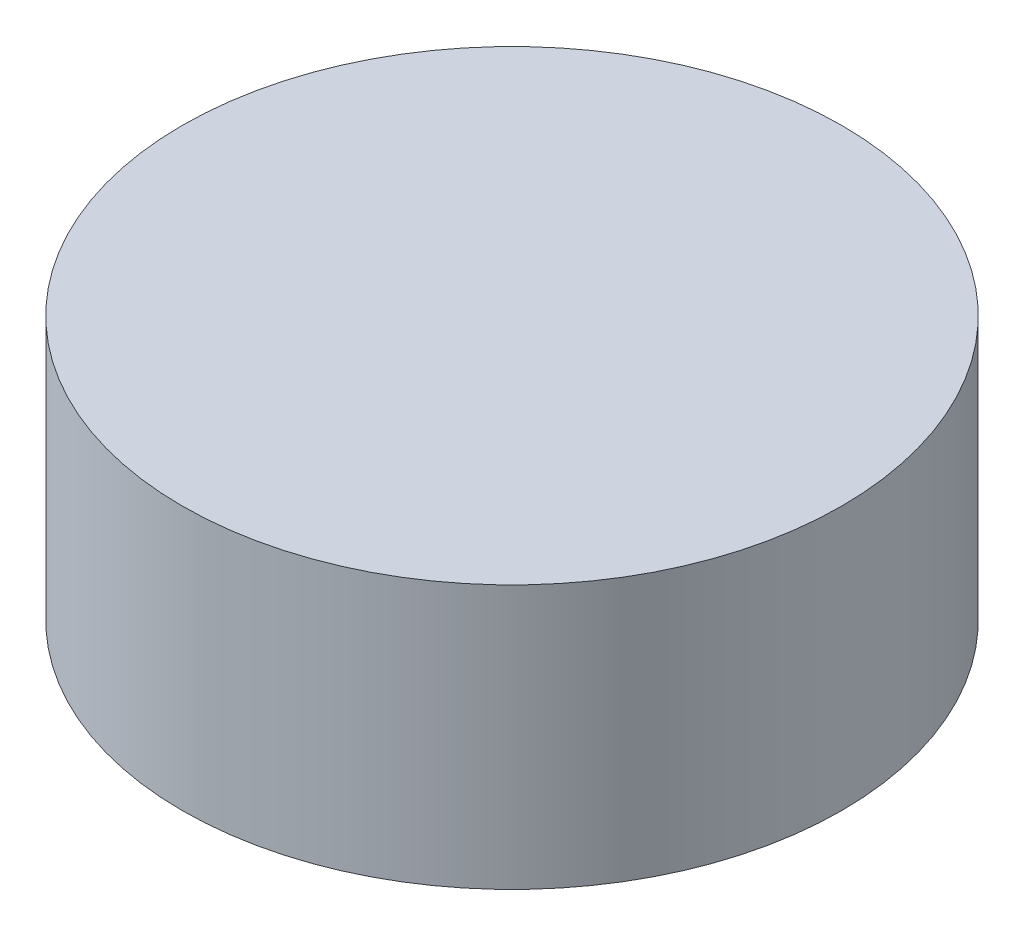
ISO-10303-21;
HEADER;
FILE_DESCRIPTION(('STEP AP214'),'2;1');
FILE_NAME('part.step','',(''),(''),'','','');
FILE_SCHEMA(('AUTOMOTIVE_DESIGN { 1 0 10303 214 1 1 1 1 }'));
ENDSEC;
DATA;
#1=APPLICATION_CONTEXT('core data for automotive mechanical design processes');
#2=APPLICATION_PROTOCOL_DEFINITION('international standard','automotive_design',2000,#1);
#3=PRODUCT_CONTEXT('',#1,'mechanical');
#4=PRODUCT('Part','Part','',(#3));
#5=PRODUCT_RELATED_PRODUCT_CATEGORY('part','',(#4));
#6=PRODUCT_DEFINITION_FORMATION('','',#4);
#7=PRODUCT_DEFINITION_CONTEXT('part definition',#1,'design');
#8=PRODUCT_DEFINITION('design','',#6,#7);
#9=PRODUCT_DEFINITION_SHAPE('','',#8);
#10=(LENGTH_UNIT() NAMED_UNIT(*) SI_UNIT(.MILLI.,.METRE.));
#11=(NAMED_UNIT(*) PLANE_ANGLE_UNIT() SI_UNIT($,.RADIAN.));
#12=(NAMED_UNIT(*) SI_UNIT($,.STERADIAN.) SOLID_ANGLE_UNIT());
#13=UNCERTAINTY_MEASURE_WITH_UNIT(LENGTH_MEASURE(1.E-05),#10,'distance_accuracy_value','');
#14=(GEOMETRIC_REPRESENTATION_CONTEXT(3) GLOBAL_UNCERTAINTY_ASSIGNED_CONTEXT((#13)) GLOBAL_UNIT_ASSIGNED_CONTEXT((#10,
#11,#12)) REPRESENTATION_CONTEXT('',''));
#15=CARTESIAN_POINT('',(0.,0.,0.));
#16=DIRECTION('',(0.,0.,1.));
#17=DIRECTION('',(1.,0.,0.));
#18=AXIS2_PLACEMENT_3D('',#15,#16,#17);
#19=CARTESIAN_POINT('',(0.,2.,0.));
#20=DIRECTION('',(0.,-1.,0.));
#21=DIRECTION('',(0.,0.,-1.));
#22=AXIS2_PLACEMENT_3D('',#19,#20,#21);
#23=CYLINDRICAL_SURFACE('',#22,2.5);
#24=CARTESIAN_POINT('',(0.,2.,0.));
#25=DIRECTION('',(0.,1.,0.));
#26=DIRECTION('',(0.,0.,1.));
#27=AXIS2_PLACEMENT_3D('',#24,#25,#26);
#28=CIRCLE('',#27,2.5);
#29=CARTESIAN_POINT('',(0.,2.,2.5));
#30=VERTEX_POINT('',#29);
#31=EDGE_CURVE('E10',#30,#30,#28,.T.);
#32=ORIENTED_EDGE('',*,*,#31,.F.);
#33=EDGE_LOOP('',(#32));
#34=FACE_BOUND('',#33,.T.);
#35=CARTESIAN_POINT('',(0.,0.,0.));
#36=DIRECTION('',(0.,1.,0.));
#37=DIRECTION('',(0.,0.,1.));
#38=AXIS2_PLACEMENT_3D('',#35,#36,#37);
#39=CIRCLE('',#38,2.5);
#40=CARTESIAN_POINT('',(0.,0.,2.5));
#41=VERTEX_POINT('',#40);
#42=EDGE_CURVE('E36',#41,#41,#39,.T.);
#43=ORIENTED_EDGE('',*,*,#42,.T.);
#44=EDGE_LOOP('',(#43));
#45=FACE_BOUND('',#44,.T.);
#46=ADVANCED_FACE('F33',(#34,#45),#23,.T.);
#47=CARTESIAN_POINT('',(0.,2.,0.));
#48=DIRECTION('',(0.,1.,0.));
#49=DIRECTION('',(0.,0.,1.));
#50=AXIS2_PLACEMENT_3D('',#47,#48,#49);
#51=PLANE('',#50);
#52=ORIENTED_EDGE('',*,*,#31,.T.);
#53=EDGE_LOOP('',(#52));
#54=FACE_BOUND('',#53,.T.);
#55=ADVANCED_FACE('F48',(#54),#51,.T.);
#56=CARTESIAN_POINT('',(0.,0.,0.));
#57=DIRECTION('',(0.,1.,0.));
#58=DIRECTION('',(0.,0.,1.));
#59=AXIS2_PLACEMENT_3D('',#56,#57,#58);
#60=PLANE('',#59);
#61=ORIENTED_EDGE('',*,*,#42,.F.);
#62=EDGE_LOOP('',(#61));
#63=FACE_BOUND('',#62,.T.);
#64=ADVANCED_FACE('F46',(#63),#60,.F.);
#65=CLOSED_SHELL('',(#46,#55,#64));
#66=MANIFOLD_SOLID_BREP('B2',#65);
#67=ADVANCED_BREP_SHAPE_REPRESENTATION('',(#18,#66),#14);
#68=SHAPE_DEFINITION_REPRESENTATION(#9,#67);
ENDSEC;
END-ISO-10303-21;
